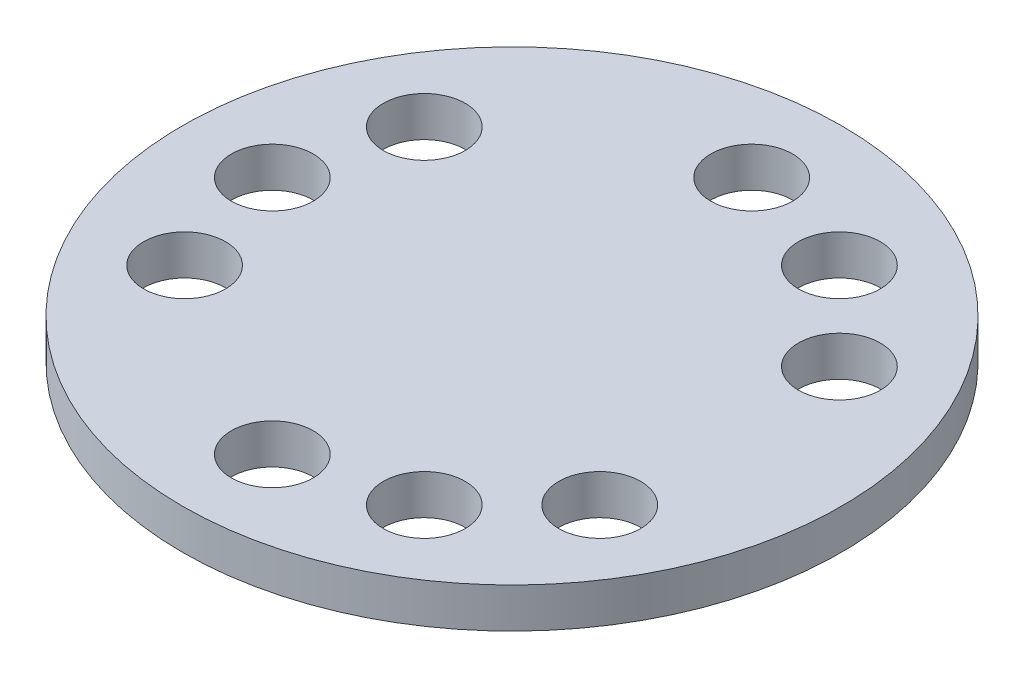
ISO-10303-21;
HEADER;
FILE_DESCRIPTION(('STEP AP214'),'2;1');
FILE_NAME('part.step','',(''),(''),'','','');
FILE_SCHEMA(('AUTOMOTIVE_DESIGN { 1 0 10303 214 1 1 1 1 }'));
ENDSEC;
DATA;
#1=APPLICATION_CONTEXT('core data for automotive mechanical design processes');
#2=APPLICATION_PROTOCOL_DEFINITION('international standard','automotive_design',2000,#1);
#3=PRODUCT_CONTEXT('',#1,'mechanical');
#4=PRODUCT('Part','Part','',(#3));
#5=PRODUCT_RELATED_PRODUCT_CATEGORY('part','',(#4));
#6=PRODUCT_DEFINITION_FORMATION('','',#4);
#7=PRODUCT_DEFINITION_CONTEXT('part definition',#1,'design');
#8=PRODUCT_DEFINITION('design','',#6,#7);
#9=PRODUCT_DEFINITION_SHAPE('','',#8);
#10=(LENGTH_UNIT() NAMED_UNIT(*) SI_UNIT(.MILLI.,.METRE.));
#11=(NAMED_UNIT(*) PLANE_ANGLE_UNIT() SI_UNIT($,.RADIAN.));
#12=(NAMED_UNIT(*) SI_UNIT($,.STERADIAN.) SOLID_ANGLE_UNIT());
#13=UNCERTAINTY_MEASURE_WITH_UNIT(LENGTH_MEASURE(1.E-05),#10,'distance_accuracy_value','');
#14=(GEOMETRIC_REPRESENTATION_CONTEXT(3) GLOBAL_UNCERTAINTY_ASSIGNED_CONTEXT((#13)) GLOBAL_UNIT_ASSIGNED_CONTEXT((#10,
#11,#12)) REPRESENTATION_CONTEXT('',''));
#15=CARTESIAN_POINT('',(0.,0.,0.));
#16=DIRECTION('',(0.,0.,1.));
#17=DIRECTION('',(1.,0.,0.));
#18=AXIS2_PLACEMENT_3D('',#15,#16,#17);
#19=CARTESIAN_POINT('',(0.,2.,0.));
#20=DIRECTION('',(0.,1.,0.));
#21=DIRECTION('',(0.,0.,1.));
#22=AXIS2_PLACEMENT_3D('',#19,#20,#21);
#23=PLANE('',#22);
#24=CARTESIAN_POINT('',(0.,2.,12.));
#25=DIRECTION('',(0.,1.,0.));
#26=DIRECTION('',(0.,0.,1.));
#27=AXIS2_PLACEMENT_3D('',#24,#25,#26);
#28=CIRCLE('',#27,2.05);
#29=CARTESIAN_POINT('',(0.,2.,14.05));
#30=VERTEX_POINT('',#29);
#31=EDGE_CURVE('E89',#30,#30,#28,.T.);
#32=ORIENTED_EDGE('',*,*,#31,.F.);
#33=EDGE_LOOP('',(#32));
#34=FACE_BOUND('',#33,.T.);
#35=CARTESIAN_POINT('',(10.3923048454132,2.,-6.00000000000006));
#36=DIRECTION('',(0.,1.,0.));
#37=DIRECTION('',(0.,0.,1.));
#38=AXIS2_PLACEMENT_3D('',#35,#36,#37);
#39=CIRCLE('',#38,2.05);
#40=CARTESIAN_POINT('',(10.3923048454132,2.,-3.95000000000006));
#41=VERTEX_POINT('',#40);
#42=EDGE_CURVE('E77',#41,#41,#39,.T.);
#43=ORIENTED_EDGE('',*,*,#42,.F.);
#44=EDGE_LOOP('',(#43));
#45=FACE_BOUND('',#44,.T.);
#46=CARTESIAN_POINT('',(0.,2.,-12.));
#47=DIRECTION('',(0.,1.,0.));
#48=DIRECTION('',(0.,0.,1.));
#49=AXIS2_PLACEMENT_3D('',#46,#47,#48);
#50=CIRCLE('',#49,2.05);
#51=CARTESIAN_POINT('',(0.,2.,-9.95));
#52=VERTEX_POINT('',#51);
#53=EDGE_CURVE('E65',#52,#52,#50,.T.);
#54=ORIENTED_EDGE('',*,*,#53,.F.);
#55=EDGE_LOOP('',(#54));
#56=FACE_BOUND('',#55,.T.);
#57=CARTESIAN_POINT('',(6.00000000000005,2.,-10.3923048454132));
#58=DIRECTION('',(0.,1.,0.));
#59=DIRECTION('',(0.,0.,1.));
#60=AXIS2_PLACEMENT_3D('',#57,#58,#59);
#61=CIRCLE('',#60,2.05);
#62=CARTESIAN_POINT('',(6.00000000000005,2.,-8.34230484541324));
#63=VERTEX_POINT('',#62);
#64=EDGE_CURVE('E53',#63,#63,#61,.T.);
#65=ORIENTED_EDGE('',*,*,#64,.F.);
#66=EDGE_LOOP('',(#65));
#67=FACE_BOUND('',#66,.T.);
#68=CARTESIAN_POINT('',(0.,2.,0.));
#69=DIRECTION('',(0.,1.,0.));
#70=DIRECTION('',(0.,0.,1.));
#71=AXIS2_PLACEMENT_3D('',#68,#69,#70);
#72=CIRCLE('',#71,16.5);
#73=CARTESIAN_POINT('',(0.,2.,16.5));
#74=VERTEX_POINT('',#73);
#75=EDGE_CURVE('E10',#74,#74,#72,.T.);
#76=ORIENTED_EDGE('',*,*,#75,.T.);
#77=EDGE_LOOP('',(#76));
#78=FACE_BOUND('',#77,.T.);
#79=CARTESIAN_POINT('',(-12.,2.,0.));
#80=DIRECTION('',(0.,1.,0.));
#81=DIRECTION('',(0.,0.,1.));
#82=AXIS2_PLACEMENT_3D('',#79,#80,#81);
#83=CIRCLE('',#82,2.05);
#84=CARTESIAN_POINT('',(-12.,2.,2.05));
#85=VERTEX_POINT('',#84);
#86=EDGE_CURVE('E48',#85,#85,#83,.T.);
#87=ORIENTED_EDGE('',*,*,#86,.F.);
#88=EDGE_LOOP('',(#87));
#89=FACE_BOUND('',#88,.T.);
#90=CARTESIAN_POINT('',(5.99999999999991,2.,10.3923048454133));
#91=DIRECTION('',(0.,1.,0.));
#92=DIRECTION('',(0.,0.,1.));
#93=AXIS2_PLACEMENT_3D('',#90,#91,#92);
#94=CIRCLE('',#93,2.05);
#95=CARTESIAN_POINT('',(5.99999999999991,2.,12.4423048454133));
#96=VERTEX_POINT('',#95);
#97=EDGE_CURVE('E59',#96,#96,#94,.T.);
#98=ORIENTED_EDGE('',*,*,#97,.F.);
#99=EDGE_LOOP('',(#98));
#100=FACE_BOUND('',#99,.T.);
#101=CARTESIAN_POINT('',(-10.3923048454133,2.,-5.99999999999997));
#102=DIRECTION('',(0.,1.,0.));
#103=DIRECTION('',(0.,0.,1.));
#104=AXIS2_PLACEMENT_3D('',#101,#102,#103);
#105=CIRCLE('',#104,2.05);
#106=CARTESIAN_POINT('',(-10.3923048454133,2.,-3.94999999999997));
#107=VERTEX_POINT('',#106);
#108=EDGE_CURVE('E71',#107,#107,#105,.T.);
#109=ORIENTED_EDGE('',*,*,#108,.F.);
#110=EDGE_LOOP('',(#109));
#111=FACE_BOUND('',#110,.T.);
#112=CARTESIAN_POINT('',(10.3923048454133,2.,5.99999999999997));
#113=DIRECTION('',(0.,1.,0.));
#114=DIRECTION('',(0.,0.,1.));
#115=AXIS2_PLACEMENT_3D('',#112,#113,#114);
#116=CIRCLE('',#115,2.05);
#117=CARTESIAN_POINT('',(10.3923048454133,2.,8.04999999999997));
#118=VERTEX_POINT('',#117);
#119=EDGE_CURVE('E83',#118,#118,#116,.T.);
#120=ORIENTED_EDGE('',*,*,#119,.F.);
#121=EDGE_LOOP('',(#120));
#122=FACE_BOUND('',#121,.T.);
#123=CARTESIAN_POINT('',(-10.3923048454132,2.,6.00000000000005));
#124=DIRECTION('',(0.,1.,0.));
#125=DIRECTION('',(0.,0.,1.));
#126=AXIS2_PLACEMENT_3D('',#123,#124,#125);
#127=CIRCLE('',#126,2.05);
#128=CARTESIAN_POINT('',(-10.3923048454132,2.,8.05000000000005));
#129=VERTEX_POINT('',#128);
#130=EDGE_CURVE('E95',#129,#129,#127,.T.);
#131=ORIENTED_EDGE('',*,*,#130,.F.);
#132=EDGE_LOOP('',(#131));
#133=FACE_BOUND('',#132,.T.);
#134=ADVANCED_FACE('F37',(#34,#45,#56,#67,#78,#89,#100,#111,#122,#133),#23,.T.);
#135=CARTESIAN_POINT('',(0.,0.,0.));
#136=DIRECTION('',(0.,1.,0.));
#137=DIRECTION('',(0.,0.,1.));
#138=AXIS2_PLACEMENT_3D('',#135,#136,#137);
#139=PLANE('',#138);
#140=CARTESIAN_POINT('',(0.,0.,0.));
#141=DIRECTION('',(0.,1.,0.));
#142=DIRECTION('',(0.,0.,1.));
#143=AXIS2_PLACEMENT_3D('',#140,#141,#142);
#144=CIRCLE('',#143,16.5);
#145=CARTESIAN_POINT('',(0.,0.,16.5));
#146=VERTEX_POINT('',#145);
#147=EDGE_CURVE('E41',#146,#146,#144,.T.);
#148=ORIENTED_EDGE('',*,*,#147,.F.);
#149=EDGE_LOOP('',(#148));
#150=FACE_BOUND('',#149,.T.);
#151=CARTESIAN_POINT('',(-12.,0.,0.));
#152=DIRECTION('',(0.,1.,0.));
#153=DIRECTION('',(0.,0.,1.));
#154=AXIS2_PLACEMENT_3D('',#151,#152,#153);
#155=CIRCLE('',#154,2.05);
#156=CARTESIAN_POINT('',(-12.,0.,2.05));
#157=VERTEX_POINT('',#156);
#158=EDGE_CURVE('E50',#157,#157,#155,.T.);
#159=ORIENTED_EDGE('',*,*,#158,.T.);
#160=EDGE_LOOP('',(#159));
#161=FACE_BOUND('',#160,.T.);
#162=CARTESIAN_POINT('',(6.00000000000005,0.,-10.3923048454132));
#163=DIRECTION('',(0.,1.,0.));
#164=DIRECTION('',(0.,0.,1.));
#165=AXIS2_PLACEMENT_3D('',#162,#163,#164);
#166=CIRCLE('',#165,2.05);
#167=CARTESIAN_POINT('',(6.00000000000005,0.,-8.34230484541324));
#168=VERTEX_POINT('',#167);
#169=EDGE_CURVE('E56',#168,#168,#166,.T.);
#170=ORIENTED_EDGE('',*,*,#169,.T.);
#171=EDGE_LOOP('',(#170));
#172=FACE_BOUND('',#171,.T.);
#173=CARTESIAN_POINT('',(5.99999999999991,0.,10.3923048454133));
#174=DIRECTION('',(0.,1.,0.));
#175=DIRECTION('',(0.,0.,1.));
#176=AXIS2_PLACEMENT_3D('',#173,#174,#175);
#177=CIRCLE('',#176,2.05);
#178=CARTESIAN_POINT('',(5.99999999999991,0.,12.4423048454133));
#179=VERTEX_POINT('',#178);
#180=EDGE_CURVE('E62',#179,#179,#177,.T.);
#181=ORIENTED_EDGE('',*,*,#180,.T.);
#182=EDGE_LOOP('',(#181));
#183=FACE_BOUND('',#182,.T.);
#184=CARTESIAN_POINT('',(0.,0.,-12.));
#185=DIRECTION('',(0.,1.,0.));
#186=DIRECTION('',(0.,0.,1.));
#187=AXIS2_PLACEMENT_3D('',#184,#185,#186);
#188=CIRCLE('',#187,2.05);
#189=CARTESIAN_POINT('',(0.,0.,-9.95));
#190=VERTEX_POINT('',#189);
#191=EDGE_CURVE('E68',#190,#190,#188,.T.);
#192=ORIENTED_EDGE('',*,*,#191,.T.);
#193=EDGE_LOOP('',(#192));
#194=FACE_BOUND('',#193,.T.);
#195=CARTESIAN_POINT('',(-10.3923048454133,0.,-5.99999999999997));
#196=DIRECTION('',(0.,1.,0.));
#197=DIRECTION('',(0.,0.,1.));
#198=AXIS2_PLACEMENT_3D('',#195,#196,#197);
#199=CIRCLE('',#198,2.05);
#200=CARTESIAN_POINT('',(-10.3923048454133,0.,-3.94999999999997));
#201=VERTEX_POINT('',#200);
#202=EDGE_CURVE('E74',#201,#201,#199,.T.);
#203=ORIENTED_EDGE('',*,*,#202,.T.);
#204=EDGE_LOOP('',(#203));
#205=FACE_BOUND('',#204,.T.);
#206=CARTESIAN_POINT('',(10.3923048454132,0.,-6.00000000000006));
#207=DIRECTION('',(0.,1.,0.));
#208=DIRECTION('',(0.,0.,1.));
#209=AXIS2_PLACEMENT_3D('',#206,#207,#208);
#210=CIRCLE('',#209,2.05);
#211=CARTESIAN_POINT('',(10.3923048454132,0.,-3.95000000000006));
#212=VERTEX_POINT('',#211);
#213=EDGE_CURVE('E80',#212,#212,#210,.T.);
#214=ORIENTED_EDGE('',*,*,#213,.T.);
#215=EDGE_LOOP('',(#214));
#216=FACE_BOUND('',#215,.T.);
#217=CARTESIAN_POINT('',(10.3923048454133,0.,5.99999999999997));
#218=DIRECTION('',(0.,1.,0.));
#219=DIRECTION('',(0.,0.,1.));
#220=AXIS2_PLACEMENT_3D('',#217,#218,#219);
#221=CIRCLE('',#220,2.05);
#222=CARTESIAN_POINT('',(10.3923048454133,0.,8.04999999999997));
#223=VERTEX_POINT('',#222);
#224=EDGE_CURVE('E86',#223,#223,#221,.T.);
#225=ORIENTED_EDGE('',*,*,#224,.T.);
#226=EDGE_LOOP('',(#225));
#227=FACE_BOUND('',#226,.T.);
#228=CARTESIAN_POINT('',(0.,0.,12.));
#229=DIRECTION('',(0.,1.,0.));
#230=DIRECTION('',(0.,0.,1.));
#231=AXIS2_PLACEMENT_3D('',#228,#229,#230);
#232=CIRCLE('',#231,2.05);
#233=CARTESIAN_POINT('',(0.,0.,14.05));
#234=VERTEX_POINT('',#233);
#235=EDGE_CURVE('E92',#234,#234,#232,.T.);
#236=ORIENTED_EDGE('',*,*,#235,.T.);
#237=EDGE_LOOP('',(#236));
#238=FACE_BOUND('',#237,.T.);
#239=CARTESIAN_POINT('',(-10.3923048454132,0.,6.00000000000005));
#240=DIRECTION('',(0.,1.,0.));
#241=DIRECTION('',(0.,0.,1.));
#242=AXIS2_PLACEMENT_3D('',#239,#240,#241);
#243=CIRCLE('',#242,2.05);
#244=CARTESIAN_POINT('',(-10.3923048454132,0.,8.05000000000005));
#245=VERTEX_POINT('',#244);
#246=EDGE_CURVE('E98',#245,#245,#243,.T.);
#247=ORIENTED_EDGE('',*,*,#246,.T.);
#248=EDGE_LOOP('',(#247));
#249=FACE_BOUND('',#248,.T.);
#250=ADVANCED_FACE('F108',(#150,#161,#172,#183,#194,#205,#216,#227,#238,#249),#139,.F.);
#251=CARTESIAN_POINT('',(0.,2.,0.));
#252=DIRECTION('',(0.,-1.,0.));
#253=DIRECTION('',(0.,0.,-1.));
#254=AXIS2_PLACEMENT_3D('',#251,#252,#253);
#255=CYLINDRICAL_SURFACE('',#254,16.5);
#256=ORIENTED_EDGE('',*,*,#75,.F.);
#257=EDGE_LOOP('',(#256));
#258=FACE_BOUND('',#257,.T.);
#259=ORIENTED_EDGE('',*,*,#147,.T.);
#260=EDGE_LOOP('',(#259));
#261=FACE_BOUND('',#260,.T.);
#262=ADVANCED_FACE('F39',(#258,#261),#255,.T.);
#263=CARTESIAN_POINT('',(-12.,2.,0.));
#264=DIRECTION('',(0.,-1.,0.));
#265=DIRECTION('',(0.,0.,-1.));
#266=AXIS2_PLACEMENT_3D('',#263,#264,#265);
#267=CYLINDRICAL_SURFACE('',#266,2.05);
#268=ORIENTED_EDGE('',*,*,#86,.T.);
#269=EDGE_LOOP('',(#268));
#270=FACE_BOUND('',#269,.T.);
#271=ORIENTED_EDGE('',*,*,#158,.F.);
#272=EDGE_LOOP('',(#271));
#273=FACE_BOUND('',#272,.T.);
#274=ADVANCED_FACE('F118',(#270,#273),#267,.F.);
#275=CARTESIAN_POINT('',(6.00000000000005,2.,-10.3923048454132));
#276=DIRECTION('',(0.,-1.,0.));
#277=DIRECTION('',(0.,0.,-1.));
#278=AXIS2_PLACEMENT_3D('',#275,#276,#277);
#279=CYLINDRICAL_SURFACE('',#278,2.05);
#280=ORIENTED_EDGE('',*,*,#64,.T.);
#281=EDGE_LOOP('',(#280));
#282=FACE_BOUND('',#281,.T.);
#283=ORIENTED_EDGE('',*,*,#169,.F.);
#284=EDGE_LOOP('',(#283));
#285=FACE_BOUND('',#284,.T.);
#286=ADVANCED_FACE('F121',(#282,#285),#279,.F.);
#287=CARTESIAN_POINT('',(5.99999999999991,2.,10.3923048454133));
#288=DIRECTION('',(0.,-1.,0.));
#289=DIRECTION('',(0.,0.,-1.));
#290=AXIS2_PLACEMENT_3D('',#287,#288,#289);
#291=CYLINDRICAL_SURFACE('',#290,2.05);
#292=ORIENTED_EDGE('',*,*,#97,.T.);
#293=EDGE_LOOP('',(#292));
#294=FACE_BOUND('',#293,.T.);
#295=ORIENTED_EDGE('',*,*,#180,.F.);
#296=EDGE_LOOP('',(#295));
#297=FACE_BOUND('',#296,.T.);
#298=ADVANCED_FACE('F125',(#294,#297),#291,.F.);
#299=CARTESIAN_POINT('',(0.,2.,-12.));
#300=DIRECTION('',(0.,-1.,0.));
#301=DIRECTION('',(0.,0.,-1.));
#302=AXIS2_PLACEMENT_3D('',#299,#300,#301);
#303=CYLINDRICAL_SURFACE('',#302,2.05);
#304=ORIENTED_EDGE('',*,*,#53,.T.);
#305=EDGE_LOOP('',(#304));
#306=FACE_BOUND('',#305,.T.);
#307=ORIENTED_EDGE('',*,*,#191,.F.);
#308=EDGE_LOOP('',(#307));
#309=FACE_BOUND('',#308,.T.);
#310=ADVANCED_FACE('F129',(#306,#309),#303,.F.);
#311=CARTESIAN_POINT('',(-10.3923048454133,2.,-5.99999999999997));
#312=DIRECTION('',(0.,-1.,0.));
#313=DIRECTION('',(0.,0.,-1.));
#314=AXIS2_PLACEMENT_3D('',#311,#312,#313);
#315=CYLINDRICAL_SURFACE('',#314,2.05);
#316=ORIENTED_EDGE('',*,*,#108,.T.);
#317=EDGE_LOOP('',(#316));
#318=FACE_BOUND('',#317,.T.);
#319=ORIENTED_EDGE('',*,*,#202,.F.);
#320=EDGE_LOOP('',(#319));
#321=FACE_BOUND('',#320,.T.);
#322=ADVANCED_FACE('F133',(#318,#321),#315,.F.);
#323=CARTESIAN_POINT('',(10.3923048454132,2.,-6.00000000000006));
#324=DIRECTION('',(0.,-1.,0.));
#325=DIRECTION('',(0.,0.,-1.));
#326=AXIS2_PLACEMENT_3D('',#323,#324,#325);
#327=CYLINDRICAL_SURFACE('',#326,2.05);
#328=ORIENTED_EDGE('',*,*,#42,.T.);
#329=EDGE_LOOP('',(#328));
#330=FACE_BOUND('',#329,.T.);
#331=ORIENTED_EDGE('',*,*,#213,.F.);
#332=EDGE_LOOP('',(#331));
#333=FACE_BOUND('',#332,.T.);
#334=ADVANCED_FACE('F137',(#330,#333),#327,.F.);
#335=CARTESIAN_POINT('',(10.3923048454133,2.,5.99999999999997));
#336=DIRECTION('',(0.,-1.,0.));
#337=DIRECTION('',(0.,0.,-1.));
#338=AXIS2_PLACEMENT_3D('',#335,#336,#337);
#339=CYLINDRICAL_SURFACE('',#338,2.05);
#340=ORIENTED_EDGE('',*,*,#119,.T.);
#341=EDGE_LOOP('',(#340));
#342=FACE_BOUND('',#341,.T.);
#343=ORIENTED_EDGE('',*,*,#224,.F.);
#344=EDGE_LOOP('',(#343));
#345=FACE_BOUND('',#344,.T.);
#346=ADVANCED_FACE('F141',(#342,#345),#339,.F.);
#347=CARTESIAN_POINT('',(0.,2.,12.));
#348=DIRECTION('',(0.,-1.,0.));
#349=DIRECTION('',(0.,0.,-1.));
#350=AXIS2_PLACEMENT_3D('',#347,#348,#349);
#351=CYLINDRICAL_SURFACE('',#350,2.05);
#352=ORIENTED_EDGE('',*,*,#31,.T.);
#353=EDGE_LOOP('',(#352));
#354=FACE_BOUND('',#353,.T.);
#355=ORIENTED_EDGE('',*,*,#235,.F.);
#356=EDGE_LOOP('',(#355));
#357=FACE_BOUND('',#356,.T.);
#358=ADVANCED_FACE('F145',(#354,#357),#351,.F.);
#359=CARTESIAN_POINT('',(-10.3923048454132,2.,6.00000000000005));
#360=DIRECTION('',(0.,-1.,0.));
#361=DIRECTION('',(0.,0.,-1.));
#362=AXIS2_PLACEMENT_3D('',#359,#360,#361);
#363=CYLINDRICAL_SURFACE('',#362,2.05);
#364=ORIENTED_EDGE('',*,*,#130,.T.);
#365=EDGE_LOOP('',(#364));
#366=FACE_BOUND('',#365,.T.);
#367=ORIENTED_EDGE('',*,*,#246,.F.);
#368=EDGE_LOOP('',(#367));
#369=FACE_BOUND('',#368,.T.);
#370=ADVANCED_FACE('F104',(#366,#369),#363,.F.);
#371=CLOSED_SHELL('',(#134,#250,#262,#274,#286,#298,#310,#322,#334,#346,#358,#370));
#372=MANIFOLD_SOLID_BREP('B2',#371);
#373=ADVANCED_BREP_SHAPE_REPRESENTATION('',(#18,#372),#14);
#374=SHAPE_DEFINITION_REPRESENTATION(#9,#373);
ENDSEC;
END-ISO-10303-21;
